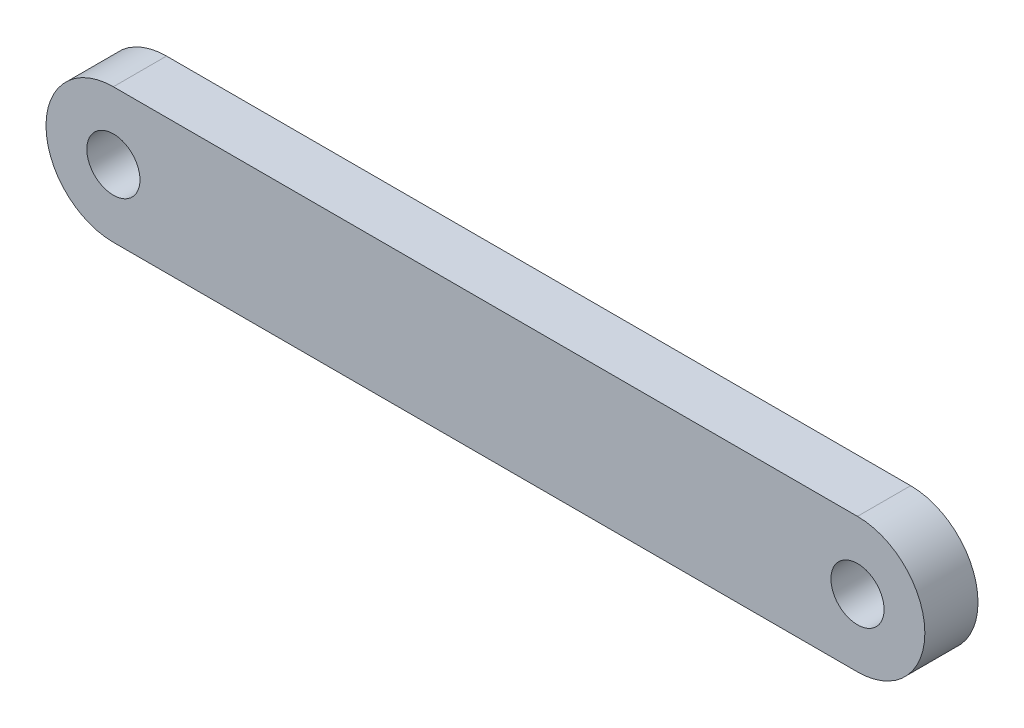
ISO-10303-21;
HEADER;
FILE_DESCRIPTION(('STEP AP214'),'2;1');
FILE_NAME('part.step','',(''),(''),'','','');
FILE_SCHEMA(('AUTOMOTIVE_DESIGN { 1 0 10303 214 1 1 1 1 }'));
ENDSEC;
DATA;
#1=APPLICATION_CONTEXT('core data for automotive mechanical design processes');
#2=APPLICATION_PROTOCOL_DEFINITION('international standard','automotive_design',2000,#1);
#3=PRODUCT_CONTEXT('',#1,'mechanical');
#4=PRODUCT('Part','Part','',(#3));
#5=PRODUCT_RELATED_PRODUCT_CATEGORY('part','',(#4));
#6=PRODUCT_DEFINITION_FORMATION('','',#4);
#7=PRODUCT_DEFINITION_CONTEXT('part definition',#1,'design');
#8=PRODUCT_DEFINITION('design','',#6,#7);
#9=PRODUCT_DEFINITION_SHAPE('','',#8);
#10=(LENGTH_UNIT() NAMED_UNIT(*) SI_UNIT(.MILLI.,.METRE.));
#11=(NAMED_UNIT(*) PLANE_ANGLE_UNIT() SI_UNIT($,.RADIAN.));
#12=(NAMED_UNIT(*) SI_UNIT($,.STERADIAN.) SOLID_ANGLE_UNIT());
#13=UNCERTAINTY_MEASURE_WITH_UNIT(LENGTH_MEASURE(1.E-05),#10,'distance_accuracy_value','');
#14=(GEOMETRIC_REPRESENTATION_CONTEXT(3) GLOBAL_UNCERTAINTY_ASSIGNED_CONTEXT((#13)) GLOBAL_UNIT_ASSIGNED_CONTEXT((#10,
#11,#12)) REPRESENTATION_CONTEXT('',''));
#15=CARTESIAN_POINT('',(0.,0.,0.));
#16=DIRECTION('',(0.,0.,1.));
#17=DIRECTION('',(1.,0.,0.));
#18=AXIS2_PLACEMENT_3D('',#15,#16,#17);
#19=CARTESIAN_POINT('',(-13.025069637883,0.,2.));
#20=DIRECTION('',(0.,0.,1.));
#21=DIRECTION('',(1.,0.,0.));
#22=AXIS2_PLACEMENT_3D('',#19,#20,#21);
#23=PLANE('',#22);
#24=CARTESIAN_POINT('',(14.974930362117,0.,2.));
#25=DIRECTION('',(0.,0.,1.));
#26=DIRECTION('',(1.,0.,0.));
#27=AXIS2_PLACEMENT_3D('',#24,#25,#26);
#28=CIRCLE('',#27,1.);
#29=CARTESIAN_POINT('',(15.974930362117,0.,2.));
#30=VERTEX_POINT('',#29);
#31=EDGE_CURVE('E100',#30,#30,#28,.T.);
#32=ORIENTED_EDGE('',*,*,#31,.F.);
#33=EDGE_LOOP('',(#32));
#34=FACE_BOUND('',#33,.T.);
#35=CARTESIAN_POINT('',(-13.025069637883,0.,2.));
#36=DIRECTION('',(0.,0.,1.));
#37=DIRECTION('',(1.,0.,0.));
#38=AXIS2_PLACEMENT_3D('',#35,#36,#37);
#39=CIRCLE('',#38,2.53481894150418);
#40=CARTESIAN_POINT('',(-13.025069637883,2.53481894150418,2.));
#41=VERTEX_POINT('',#40);
#42=CARTESIAN_POINT('',(-13.025069637883,-2.53481894150418,2.));
#43=VERTEX_POINT('',#42);
#44=EDGE_CURVE('E85',#41,#43,#39,.T.);
#45=ORIENTED_EDGE('',*,*,#44,.T.);
#46=DIRECTION('',(1.,0.,0.));
#47=VECTOR('',#46,1.);
#48=CARTESIAN_POINT('',(-13.025069637883,-2.53481894150418,2.));
#49=LINE('',#48,#47);
#50=CARTESIAN_POINT('',(14.974930362117,-2.53481894150418,2.));
#51=VERTEX_POINT('',#50);
#52=EDGE_CURVE('E80',#43,#51,#49,.T.);
#53=ORIENTED_EDGE('',*,*,#52,.T.);
#54=CARTESIAN_POINT('',(14.974930362117,0.,2.));
#55=DIRECTION('',(0.,0.,1.));
#56=DIRECTION('',(1.,0.,0.));
#57=AXIS2_PLACEMENT_3D('',#54,#55,#56);
#58=CIRCLE('',#57,2.53481894150418);
#59=CARTESIAN_POINT('',(14.974930362117,2.53481894150418,2.));
#60=VERTEX_POINT('',#59);
#61=EDGE_CURVE('E83',#51,#60,#58,.T.);
#62=ORIENTED_EDGE('',*,*,#61,.T.);
#63=DIRECTION('',(-1.,0.,0.));
#64=VECTOR('',#63,1.);
#65=CARTESIAN_POINT('',(-13.025069637883,2.53481894150418,2.));
#66=LINE('',#65,#64);
#67=EDGE_CURVE('E50',#60,#41,#66,.T.);
#68=ORIENTED_EDGE('',*,*,#67,.T.);
#69=EDGE_LOOP('',(#45,#53,#62,#68));
#70=FACE_BOUND('',#69,.T.);
#71=CARTESIAN_POINT('',(-13.025069637883,0.,2.));
#72=DIRECTION('',(0.,0.,1.));
#73=DIRECTION('',(1.,0.,0.));
#74=AXIS2_PLACEMENT_3D('',#71,#72,#73);
#75=CIRCLE('',#74,1.);
#76=CARTESIAN_POINT('',(-12.025069637883,0.,2.));
#77=VERTEX_POINT('',#76);
#78=EDGE_CURVE('E115',#77,#77,#75,.T.);
#79=ORIENTED_EDGE('',*,*,#78,.F.);
#80=EDGE_LOOP('',(#79));
#81=FACE_BOUND('',#80,.T.);
#82=ADVANCED_FACE('F33',(#34,#70,#81),#23,.T.);
#83=CARTESIAN_POINT('',(-13.025069637883,0.,0.));
#84=DIRECTION('',(0.,0.,1.));
#85=DIRECTION('',(1.,0.,0.));
#86=AXIS2_PLACEMENT_3D('',#83,#84,#85);
#87=PLANE('',#86);
#88=CARTESIAN_POINT('',(-13.025069637883,0.,0.));
#89=DIRECTION('',(0.,0.,1.));
#90=DIRECTION('',(1.,0.,0.));
#91=AXIS2_PLACEMENT_3D('',#88,#89,#90);
#92=CIRCLE('',#91,2.53481894150418);
#93=CARTESIAN_POINT('',(-13.025069637883,2.53481894150418,0.));
#94=VERTEX_POINT('',#93);
#95=CARTESIAN_POINT('',(-13.025069637883,-2.53481894150418,0.));
#96=VERTEX_POINT('',#95);
#97=EDGE_CURVE('E97',#94,#96,#92,.T.);
#98=ORIENTED_EDGE('',*,*,#97,.F.);
#99=DIRECTION('',(-1.,0.,0.));
#100=VECTOR('',#99,1.);
#101=CARTESIAN_POINT('',(-13.025069637883,2.53481894150418,0.));
#102=LINE('',#101,#100);
#103=CARTESIAN_POINT('',(14.974930362117,2.53481894150418,0.));
#104=VERTEX_POINT('',#103);
#105=EDGE_CURVE('E73',#104,#94,#102,.T.);
#106=ORIENTED_EDGE('',*,*,#105,.F.);
#107=CARTESIAN_POINT('',(14.974930362117,0.,0.));
#108=DIRECTION('',(0.,0.,1.));
#109=DIRECTION('',(1.,0.,0.));
#110=AXIS2_PLACEMENT_3D('',#107,#108,#109);
#111=CIRCLE('',#110,2.53481894150418);
#112=CARTESIAN_POINT('',(14.974930362117,-2.53481894150418,0.));
#113=VERTEX_POINT('',#112);
#114=EDGE_CURVE('E67',#113,#104,#111,.T.);
#115=ORIENTED_EDGE('',*,*,#114,.F.);
#116=DIRECTION('',(1.,0.,0.));
#117=VECTOR('',#116,1.);
#118=CARTESIAN_POINT('',(-13.025069637883,-2.53481894150418,0.));
#119=LINE('',#118,#117);
#120=EDGE_CURVE('E89',#96,#113,#119,.T.);
#121=ORIENTED_EDGE('',*,*,#120,.F.);
#122=EDGE_LOOP('',(#98,#106,#115,#121));
#123=FACE_BOUND('',#122,.T.);
#124=CARTESIAN_POINT('',(14.974930362117,0.,0.));
#125=DIRECTION('',(0.,0.,1.));
#126=DIRECTION('',(1.,0.,0.));
#127=AXIS2_PLACEMENT_3D('',#124,#125,#126);
#128=CIRCLE('',#127,1.);
#129=CARTESIAN_POINT('',(15.974930362117,0.,0.));
#130=VERTEX_POINT('',#129);
#131=EDGE_CURVE('E112',#130,#130,#128,.T.);
#132=ORIENTED_EDGE('',*,*,#131,.T.);
#133=EDGE_LOOP('',(#132));
#134=FACE_BOUND('',#133,.T.);
#135=CARTESIAN_POINT('',(-13.025069637883,0.,0.));
#136=DIRECTION('',(0.,0.,1.));
#137=DIRECTION('',(1.,0.,0.));
#138=AXIS2_PLACEMENT_3D('',#135,#136,#137);
#139=CIRCLE('',#138,1.);
#140=CARTESIAN_POINT('',(-12.025069637883,0.,0.));
#141=VERTEX_POINT('',#140);
#142=EDGE_CURVE('E118',#141,#141,#139,.T.);
#143=ORIENTED_EDGE('',*,*,#142,.T.);
#144=EDGE_LOOP('',(#143));
#145=FACE_BOUND('',#144,.T.);
#146=ADVANCED_FACE('F108',(#123,#134,#145),#87,.F.);
#147=CARTESIAN_POINT('',(-13.025069637883,0.,2.));
#148=DIRECTION('',(0.,0.,-1.));
#149=DIRECTION('',(-1.,0.,0.));
#150=AXIS2_PLACEMENT_3D('',#147,#148,#149);
#151=CYLINDRICAL_SURFACE('',#150,2.53481894150418);
#152=ORIENTED_EDGE('',*,*,#97,.T.);
#153=DIRECTION('',(0.,0.,-1.));
#154=VECTOR('',#153,1.);
#155=CARTESIAN_POINT('',(-13.025069637883,-2.53481894150418,2.));
#156=LINE('',#155,#154);
#157=EDGE_CURVE('E11',#43,#96,#156,.T.);
#158=ORIENTED_EDGE('',*,*,#157,.F.);
#159=ORIENTED_EDGE('',*,*,#44,.F.);
#160=DIRECTION('',(0.,0.,-1.));
#161=VECTOR('',#160,1.);
#162=CARTESIAN_POINT('',(-13.025069637883,2.53481894150418,2.));
#163=LINE('',#162,#161);
#164=EDGE_CURVE('E93',#41,#94,#163,.T.);
#165=ORIENTED_EDGE('',*,*,#164,.T.);
#166=EDGE_LOOP('',(#152,#158,#159,#165));
#167=FACE_BOUND('',#166,.T.);
#168=ADVANCED_FACE('F35',(#167),#151,.T.);
#169=CARTESIAN_POINT('',(-13.025069637883,-2.53481894150418,2.));
#170=DIRECTION('',(0.,1.,0.));
#171=DIRECTION('',(0.,0.,1.));
#172=AXIS2_PLACEMENT_3D('',#169,#170,#171);
#173=PLANE('',#172);
#174=ORIENTED_EDGE('',*,*,#120,.T.);
#175=DIRECTION('',(0.,0.,-1.));
#176=VECTOR('',#175,1.);
#177=CARTESIAN_POINT('',(14.974930362117,-2.53481894150418,2.));
#178=LINE('',#177,#176);
#179=EDGE_CURVE('E42',#51,#113,#178,.T.);
#180=ORIENTED_EDGE('',*,*,#179,.F.);
#181=ORIENTED_EDGE('',*,*,#52,.F.);
#182=ORIENTED_EDGE('',*,*,#157,.T.);
#183=EDGE_LOOP('',(#174,#180,#181,#182));
#184=FACE_BOUND('',#183,.T.);
#185=ADVANCED_FACE('F88',(#184),#173,.F.);
#186=CARTESIAN_POINT('',(14.974930362117,0.,2.));
#187=DIRECTION('',(0.,0.,-1.));
#188=DIRECTION('',(-1.,0.,0.));
#189=AXIS2_PLACEMENT_3D('',#186,#187,#188);
#190=CYLINDRICAL_SURFACE('',#189,2.53481894150418);
#191=ORIENTED_EDGE('',*,*,#114,.T.);
#192=DIRECTION('',(0.,0.,-1.));
#193=VECTOR('',#192,1.);
#194=CARTESIAN_POINT('',(14.974930362117,2.53481894150418,2.));
#195=LINE('',#194,#193);
#196=EDGE_CURVE('E90',#60,#104,#195,.T.);
#197=ORIENTED_EDGE('',*,*,#196,.F.);
#198=ORIENTED_EDGE('',*,*,#61,.F.);
#199=ORIENTED_EDGE('',*,*,#179,.T.);
#200=EDGE_LOOP('',(#191,#197,#198,#199));
#201=FACE_BOUND('',#200,.T.);
#202=ADVANCED_FACE('F91',(#201),#190,.T.);
#203=CARTESIAN_POINT('',(-13.025069637883,2.53481894150418,2.));
#204=DIRECTION('',(0.,-1.,0.));
#205=DIRECTION('',(0.,0.,-1.));
#206=AXIS2_PLACEMENT_3D('',#203,#204,#205);
#207=PLANE('',#206);
#208=ORIENTED_EDGE('',*,*,#105,.T.);
#209=ORIENTED_EDGE('',*,*,#164,.F.);
#210=ORIENTED_EDGE('',*,*,#67,.F.);
#211=ORIENTED_EDGE('',*,*,#196,.T.);
#212=EDGE_LOOP('',(#208,#209,#210,#211));
#213=FACE_BOUND('',#212,.T.);
#214=ADVANCED_FACE('F105',(#213),#207,.F.);
#215=CARTESIAN_POINT('',(14.974930362117,0.,2.));
#216=DIRECTION('',(0.,0.,-1.));
#217=DIRECTION('',(-1.,0.,0.));
#218=AXIS2_PLACEMENT_3D('',#215,#216,#217);
#219=CYLINDRICAL_SURFACE('',#218,1.);
#220=ORIENTED_EDGE('',*,*,#31,.T.);
#221=EDGE_LOOP('',(#220));
#222=FACE_BOUND('',#221,.T.);
#223=ORIENTED_EDGE('',*,*,#131,.F.);
#224=EDGE_LOOP('',(#223));
#225=FACE_BOUND('',#224,.T.);
#226=ADVANCED_FACE('F135',(#222,#225),#219,.F.);
#227=CARTESIAN_POINT('',(-13.025069637883,0.,2.));
#228=DIRECTION('',(0.,0.,-1.));
#229=DIRECTION('',(-1.,0.,0.));
#230=AXIS2_PLACEMENT_3D('',#227,#228,#229);
#231=CYLINDRICAL_SURFACE('',#230,1.);
#232=ORIENTED_EDGE('',*,*,#78,.T.);
#233=EDGE_LOOP('',(#232));
#234=FACE_BOUND('',#233,.T.);
#235=ORIENTED_EDGE('',*,*,#142,.F.);
#236=EDGE_LOOP('',(#235));
#237=FACE_BOUND('',#236,.T.);
#238=ADVANCED_FACE('F124',(#234,#237),#231,.F.);
#239=CLOSED_SHELL('',(#82,#146,#168,#185,#202,#214,#226,#238));
#240=MANIFOLD_SOLID_BREP('B2',#239);
#241=ADVANCED_BREP_SHAPE_REPRESENTATION('',(#18,#240),#14);
#242=SHAPE_DEFINITION_REPRESENTATION(#9,#241);
ENDSEC;
END-ISO-10303-21;
